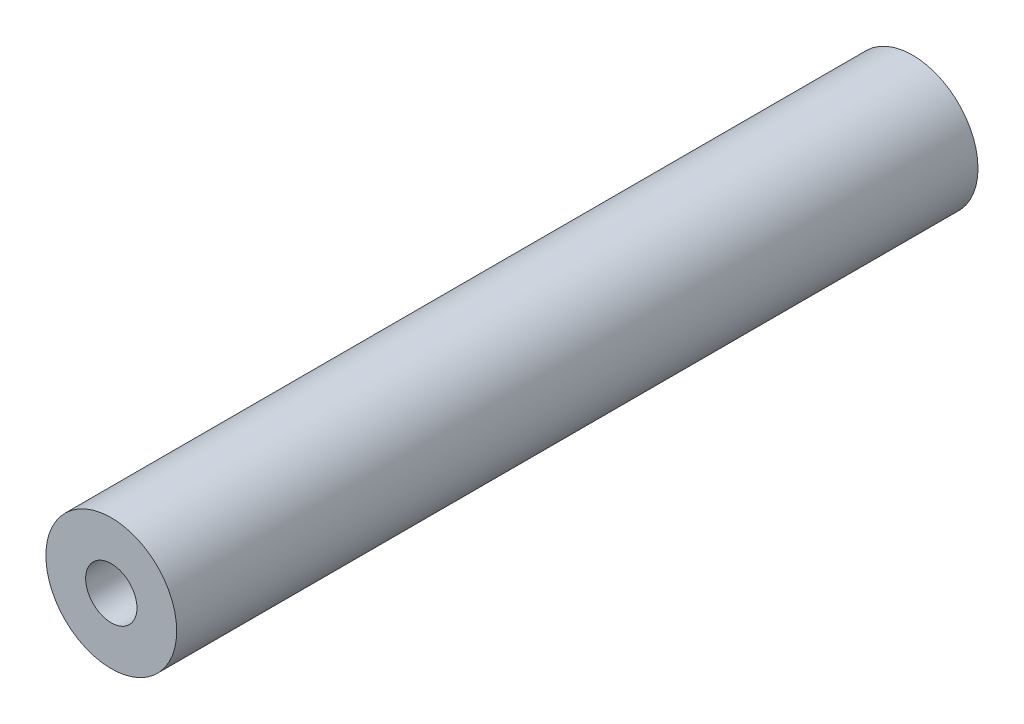
ISO-10303-21;
HEADER;
FILE_DESCRIPTION(('STEP AP214'),'2;1');
FILE_NAME('part.step','',(''),(''),'','','');
FILE_SCHEMA(('AUTOMOTIVE_DESIGN { 1 0 10303 214 1 1 1 1 }'));
ENDSEC;
DATA;
#1=APPLICATION_CONTEXT('core data for automotive mechanical design processes');
#2=APPLICATION_PROTOCOL_DEFINITION('international standard','automotive_design',2000,#1);
#3=PRODUCT_CONTEXT('',#1,'mechanical');
#4=PRODUCT('Part','Part','',(#3));
#5=PRODUCT_RELATED_PRODUCT_CATEGORY('part','',(#4));
#6=PRODUCT_DEFINITION_FORMATION('','',#4);
#7=PRODUCT_DEFINITION_CONTEXT('part definition',#1,'design');
#8=PRODUCT_DEFINITION('design','',#6,#7);
#9=PRODUCT_DEFINITION_SHAPE('','',#8);
#10=(LENGTH_UNIT() NAMED_UNIT(*) SI_UNIT(.MILLI.,.METRE.));
#11=(NAMED_UNIT(*) PLANE_ANGLE_UNIT() SI_UNIT($,.RADIAN.));
#12=(NAMED_UNIT(*) SI_UNIT($,.STERADIAN.) SOLID_ANGLE_UNIT());
#13=UNCERTAINTY_MEASURE_WITH_UNIT(LENGTH_MEASURE(1.E-05),#10,'distance_accuracy_value','');
#14=(GEOMETRIC_REPRESENTATION_CONTEXT(3) GLOBAL_UNCERTAINTY_ASSIGNED_CONTEXT((#13)) GLOBAL_UNIT_ASSIGNED_CONTEXT((#10,
#11,#12)) REPRESENTATION_CONTEXT('',''));
#15=CARTESIAN_POINT('',(0.,0.,0.));
#16=DIRECTION('',(0.,0.,1.));
#17=DIRECTION('',(1.,0.,0.));
#18=AXIS2_PLACEMENT_3D('',#15,#16,#17);
#19=CARTESIAN_POINT('',(0.,0.,77.7875));
#20=DIRECTION('',(0.,0.,1.));
#21=DIRECTION('',(1.,0.,0.));
#22=AXIS2_PLACEMENT_3D('',#19,#20,#21);
#23=PLANE('',#22);
#24=CARTESIAN_POINT('',(0.,0.,77.7875));
#25=DIRECTION('',(0.,0.,1.));
#26=DIRECTION('',(1.,0.,0.));
#27=AXIS2_PLACEMENT_3D('',#24,#25,#26);
#28=CIRCLE('',#27,6.35);
#29=CARTESIAN_POINT('',(6.35,0.,77.7875));
#30=VERTEX_POINT('',#29);
#31=EDGE_CURVE('E10',#30,#30,#28,.T.);
#32=ORIENTED_EDGE('',*,*,#31,.T.);
#33=EDGE_LOOP('',(#32));
#34=FACE_BOUND('',#33,.T.);
#35=CARTESIAN_POINT('',(0.,0.,77.7875));
#36=DIRECTION('',(0.,0.,1.));
#37=DIRECTION('',(1.,0.,0.));
#38=AXIS2_PLACEMENT_3D('',#35,#36,#37);
#39=CIRCLE('',#38,2.4892);
#40=CARTESIAN_POINT('',(2.4892,0.,77.7875));
#41=VERTEX_POINT('',#40);
#42=EDGE_CURVE('E56',#41,#41,#39,.T.);
#43=ORIENTED_EDGE('',*,*,#42,.F.);
#44=EDGE_LOOP('',(#43));
#45=FACE_BOUND('',#44,.T.);
#46=ADVANCED_FACE('F43',(#34,#45),#23,.T.);
#47=CARTESIAN_POINT('',(0.,0.,0.));
#48=DIRECTION('',(0.,0.,1.));
#49=DIRECTION('',(1.,0.,0.));
#50=AXIS2_PLACEMENT_3D('',#47,#48,#49);
#51=PLANE('',#50);
#52=CARTESIAN_POINT('',(0.,0.,0.));
#53=DIRECTION('',(0.,0.,1.));
#54=DIRECTION('',(1.,0.,0.));
#55=AXIS2_PLACEMENT_3D('',#52,#53,#54);
#56=CIRCLE('',#55,6.35);
#57=CARTESIAN_POINT('',(6.35,0.,0.));
#58=VERTEX_POINT('',#57);
#59=EDGE_CURVE('E47',#58,#58,#56,.T.);
#60=ORIENTED_EDGE('',*,*,#59,.F.);
#61=EDGE_LOOP('',(#60));
#62=FACE_BOUND('',#61,.T.);
#63=CARTESIAN_POINT('',(0.,0.,0.));
#64=DIRECTION('',(0.,0.,1.));
#65=DIRECTION('',(1.,0.,0.));
#66=AXIS2_PLACEMENT_3D('',#63,#64,#65);
#67=CIRCLE('',#66,2.4892);
#68=CARTESIAN_POINT('',(2.4892,0.,0.));
#69=VERTEX_POINT('',#68);
#70=EDGE_CURVE('E58',#69,#69,#67,.T.);
#71=ORIENTED_EDGE('',*,*,#70,.T.);
#72=EDGE_LOOP('',(#71));
#73=FACE_BOUND('',#72,.T.);
#74=ADVANCED_FACE('F70',(#62,#73),#51,.F.);
#75=CARTESIAN_POINT('',(0.,0.,77.7875));
#76=DIRECTION('',(0.,0.,-1.));
#77=DIRECTION('',(-1.,0.,0.));
#78=AXIS2_PLACEMENT_3D('',#75,#76,#77);
#79=CYLINDRICAL_SURFACE('',#78,6.35);
#80=ORIENTED_EDGE('',*,*,#31,.F.);
#81=EDGE_LOOP('',(#80));
#82=FACE_BOUND('',#81,.T.);
#83=ORIENTED_EDGE('',*,*,#59,.T.);
#84=EDGE_LOOP('',(#83));
#85=FACE_BOUND('',#84,.T.);
#86=ADVANCED_FACE('F45',(#82,#85),#79,.T.);
#87=CARTESIAN_POINT('',(0.,0.,77.7875));
#88=DIRECTION('',(0.,0.,-1.));
#89=DIRECTION('',(-1.,0.,0.));
#90=AXIS2_PLACEMENT_3D('',#87,#88,#89);
#91=CYLINDRICAL_SURFACE('',#90,2.4892);
#92=ORIENTED_EDGE('',*,*,#42,.T.);
#93=EDGE_LOOP('',(#92));
#94=FACE_BOUND('',#93,.T.);
#95=ORIENTED_EDGE('',*,*,#70,.F.);
#96=EDGE_LOOP('',(#95));
#97=FACE_BOUND('',#96,.T.);
#98=ADVANCED_FACE('F66',(#94,#97),#91,.F.);
#99=CLOSED_SHELL('',(#46,#74,#86,#98));
#100=MANIFOLD_SOLID_BREP('B2',#99);
#101=ADVANCED_BREP_SHAPE_REPRESENTATION('',(#18,#100),#14);
#102=SHAPE_DEFINITION_REPRESENTATION(#9,#101);
ENDSEC;
END-ISO-10303-21;
